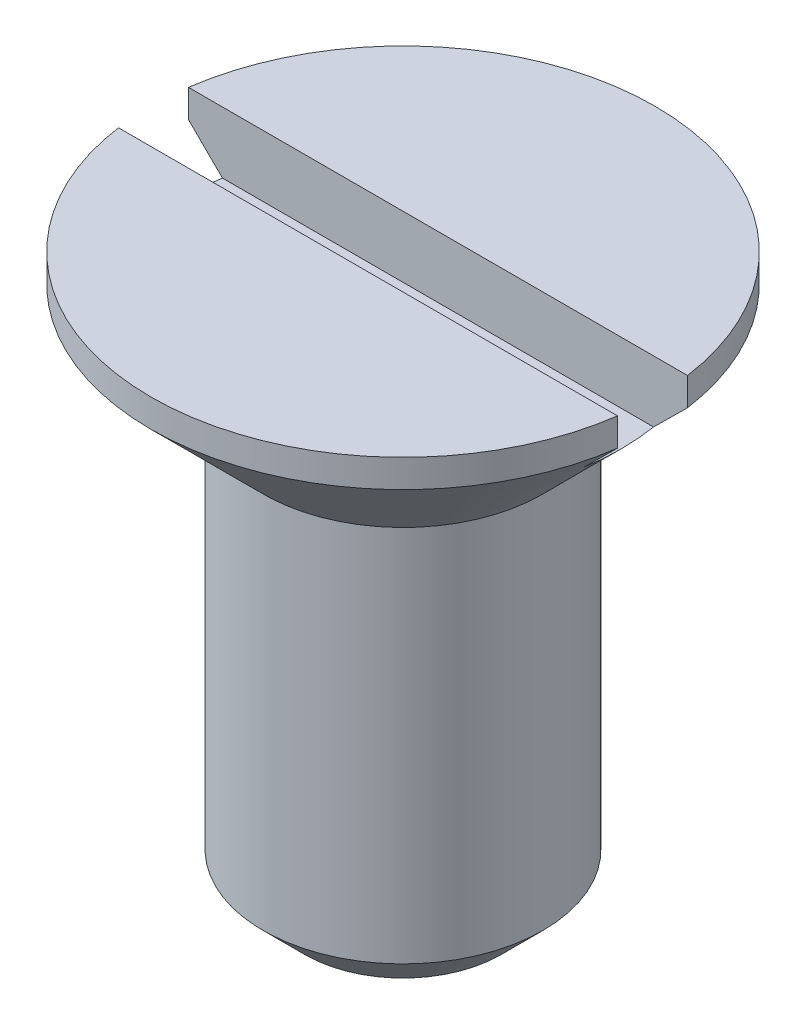
ISO-10303-21;
HEADER;
FILE_DESCRIPTION(('STEP AP214'),'2;1');
FILE_NAME('part.step','',(''),(''),'','','');
FILE_SCHEMA(('AUTOMOTIVE_DESIGN { 1 0 10303 214 1 1 1 1 }'));
ENDSEC;
DATA;
#1=APPLICATION_CONTEXT('core data for automotive mechanical design processes');
#2=APPLICATION_PROTOCOL_DEFINITION('international standard','automotive_design',2000,#1);
#3=PRODUCT_CONTEXT('',#1,'mechanical');
#4=PRODUCT('Part','Part','',(#3));
#5=PRODUCT_RELATED_PRODUCT_CATEGORY('part','',(#4));
#6=PRODUCT_DEFINITION_FORMATION('','',#4);
#7=PRODUCT_DEFINITION_CONTEXT('part definition',#1,'design');
#8=PRODUCT_DEFINITION('design','',#6,#7);
#9=PRODUCT_DEFINITION_SHAPE('','',#8);
#10=(LENGTH_UNIT() NAMED_UNIT(*) SI_UNIT(.MILLI.,.METRE.));
#11=(NAMED_UNIT(*) PLANE_ANGLE_UNIT() SI_UNIT($,.RADIAN.));
#12=(NAMED_UNIT(*) SI_UNIT($,.STERADIAN.) SOLID_ANGLE_UNIT());
#13=UNCERTAINTY_MEASURE_WITH_UNIT(LENGTH_MEASURE(1.E-05),#10,'distance_accuracy_value','');
#14=(GEOMETRIC_REPRESENTATION_CONTEXT(3) GLOBAL_UNCERTAINTY_ASSIGNED_CONTEXT((#13)) GLOBAL_UNIT_ASSIGNED_CONTEXT((#10,
#11,#12)) REPRESENTATION_CONTEXT('',''));
#15=CARTESIAN_POINT('',(0.,0.,0.));
#16=DIRECTION('',(0.,0.,1.));
#17=DIRECTION('',(1.,0.,0.));
#18=AXIS2_PLACEMENT_3D('',#15,#16,#17);
#19=CARTESIAN_POINT('',(0.,125.763182897862,0.));
#20=DIRECTION('',(0.,1.,0.));
#21=DIRECTION('',(-1.,0.,0.));
#22=AXIS2_PLACEMENT_3D('',#19,#20,#21);
#23=CYLINDRICAL_SURFACE('',#22,9.00000000000001);
#24=CARTESIAN_POINT('',(0.,91.0350422227854,0.));
#25=DIRECTION('',(0.,1.,0.));
#26=DIRECTION('',(-1.,0.,0.));
#27=AXIS2_PLACEMENT_3D('',#24,#25,#26);
#28=CIRCLE('',#27,9.00000000000001);
#29=CARTESIAN_POINT('',(8.91277173498795,91.0350422227854,-1.25));
#30=VERTEX_POINT('',#29);
#31=CARTESIAN_POINT('',(-8.91277173498796,91.0350422227854,-1.25));
#32=VERTEX_POINT('',#31);
#33=EDGE_CURVE('E103',#30,#32,#28,.T.);
#34=ORIENTED_EDGE('',*,*,#33,.T.);
#35=DIRECTION('',(0.,1.,0.));
#36=VECTOR('',#35,1.);
#37=CARTESIAN_POINT('',(-8.91277173498796,125.763182897862,-1.25));
#38=LINE('',#37,#36);
#39=CARTESIAN_POINT('',(-8.91277173498796,92.0350422227854,-1.25));
#40=VERTEX_POINT('',#39);
#41=EDGE_CURVE('E136',#32,#40,#38,.T.);
#42=ORIENTED_EDGE('',*,*,#41,.T.);
#43=CARTESIAN_POINT('',(0.,92.0350422227854,0.));
#44=DIRECTION('',(0.,1.,0.));
#45=DIRECTION('',(-1.,0.,0.));
#46=AXIS2_PLACEMENT_3D('',#43,#44,#45);
#47=CIRCLE('',#46,9.00000000000001);
#48=CARTESIAN_POINT('',(8.91277173498795,92.0350422227854,-1.25));
#49=VERTEX_POINT('',#48);
#50=EDGE_CURVE('E100',#49,#40,#47,.T.);
#51=ORIENTED_EDGE('',*,*,#50,.F.);
#52=DIRECTION('',(0.,1.,0.));
#53=VECTOR('',#52,1.);
#54=CARTESIAN_POINT('',(8.91277173498795,125.763182897862,-1.25));
#55=LINE('',#54,#53);
#56=EDGE_CURVE('E106',#49,#30,#55,.F.);
#57=ORIENTED_EDGE('',*,*,#56,.T.);
#58=EDGE_LOOP('',(#34,#42,#51,#57));
#59=FACE_BOUND('',#58,.T.);
#60=ADVANCED_FACE('F29',(#59),#23,.T.);
#61=CARTESIAN_POINT('',(0.,92.0350422227854,0.));
#62=DIRECTION('',(0.,-1.,0.));
#63=DIRECTION('',(1.,0.,0.));
#64=AXIS2_PLACEMENT_3D('',#61,#62,#63);
#65=PLANE('',#64);
#66=ORIENTED_EDGE('',*,*,#50,.T.);
#67=DIRECTION('',(1.,0.,0.));
#68=VECTOR('',#67,1.);
#69=CARTESIAN_POINT('',(0.,92.0350422227854,-1.25));
#70=LINE('',#69,#68);
#71=EDGE_CURVE('E88',#40,#49,#70,.T.);
#72=ORIENTED_EDGE('',*,*,#71,.T.);
#73=EDGE_LOOP('',(#66,#72));
#74=FACE_BOUND('',#73,.T.);
#75=ADVANCED_FACE('F162',(#74),#65,.F.);
#76=CARTESIAN_POINT('',(-8.91277173498796,91.0350422227854,1.25));
#77=VERTEX_POINT('',#76);
#78=CARTESIAN_POINT('',(8.91277173498795,91.0350422227854,1.25));
#79=VERTEX_POINT('',#78);
#80=EDGE_CURVE('E89',#77,#79,#28,.T.);
#81=ORIENTED_EDGE('',*,*,#80,.T.);
#82=DIRECTION('',(0.,1.,0.));
#83=VECTOR('',#82,1.);
#84=CARTESIAN_POINT('',(8.91277173498795,125.763182897862,1.25));
#85=LINE('',#84,#83);
#86=CARTESIAN_POINT('',(8.91277173498795,92.0350422227854,1.25));
#87=VERTEX_POINT('',#86);
#88=EDGE_CURVE('E83',#79,#87,#85,.T.);
#89=ORIENTED_EDGE('',*,*,#88,.T.);
#90=CARTESIAN_POINT('',(-8.91277173498796,92.0350422227854,1.25));
#91=VERTEX_POINT('',#90);
#92=EDGE_CURVE('E93',#91,#87,#47,.T.);
#93=ORIENTED_EDGE('',*,*,#92,.F.);
#94=DIRECTION('',(0.,1.,0.));
#95=VECTOR('',#94,1.);
#96=CARTESIAN_POINT('',(-8.91277173498796,125.763182897862,1.25));
#97=LINE('',#96,#95);
#98=EDGE_CURVE('E44',#91,#77,#97,.F.);
#99=ORIENTED_EDGE('',*,*,#98,.T.);
#100=EDGE_LOOP('',(#81,#89,#93,#99));
#101=FACE_BOUND('',#100,.T.);
#102=ADVANCED_FACE('F31',(#101),#23,.T.);
#103=CARTESIAN_POINT('',(0.,87.0350422227853,0.));
#104=DIRECTION('',(0.,1.,0.));
#105=DIRECTION('',(-1.,0.,0.));
#106=AXIS2_PLACEMENT_3D('',#103,#104,#105);
#107=CONICAL_SURFACE('',#106,5.00000000000001,0.785398163397446);
#108=ORIENTED_EDGE('',*,*,#33,.F.);
#109=CARTESIAN_POINT('',(19.7847251861902,101.859215615214,-1.25));
#110=CARTESIAN_POINT('',(19.1078339600706,101.183681664968,-1.25));
#111=CARTESIAN_POINT('',(18.4308835719795,100.508206961128,-1.25));
#112=CARTESIAN_POINT('',(17.0767780305073,99.1574394616129,-1.25));
#113=CARTESIAN_POINT('',(16.3996228737938,98.4821466692792,-1.25));
#114=CARTESIAN_POINT('',(15.0447829505632,97.1315687919128,-1.25));
#115=CARTESIAN_POINT('',(14.367098080507,96.4562838107283,-1.25));
#116=CARTESIAN_POINT('',(13.0113319594655,95.1061346836345,-1.25));
#117=CARTESIAN_POINT('',(12.3332507153435,94.4312705308337,-1.25));
#118=CARTESIAN_POINT('',(10.9605291891881,93.0663655002733,-1.25));
#119=CARTESIAN_POINT('',(10.2658736173766,92.3763399902808,-1.25));
#120=CARTESIAN_POINT('',(9.22295280283609,91.3422105610102,-1.25));
#121=CARTESIAN_POINT('',(8.87514715924491,90.9976432036848,-1.25));
#122=CARTESIAN_POINT('',(8.17909957243933,90.3089528258849,-1.25));
#123=CARTESIAN_POINT('',(7.83085763146732,89.9648298031449,-1.25));
#124=CARTESIAN_POINT('',(7.13381711358687,89.2773174627688,-1.25));
#125=CARTESIAN_POINT('',(6.78501869257612,88.9339279871064,-1.25));
#126=CARTESIAN_POINT('',(6.08643054083817,88.2481435452596,-1.25));
#127=CARTESIAN_POINT('',(5.73664079073574,87.9057485987816,-1.25));
#128=CARTESIAN_POINT('',(5.21072174096608,87.3934545750068,-1.25));
#129=CARTESIAN_POINT('',(5.03521758044936,87.2229139461952,-1.25));
#130=CARTESIAN_POINT('',(4.68364134829781,86.8824193192547,-1.25));
#131=CARTESIAN_POINT('',(4.50756927790836,86.7124653198409,-1.25));
#132=CARTESIAN_POINT('',(4.15464470238655,86.3733803825754,-1.25));
#133=CARTESIAN_POINT('',(3.97779222217955,86.2042494187945,-1.25));
#134=CARTESIAN_POINT('',(3.62296018910056,85.8671747406901,-1.25));
#135=CARTESIAN_POINT('',(3.44498065034489,85.699231011552,-1.25));
#136=CARTESIAN_POINT('',(3.21785413901981,85.4871131957764,-1.25));
#137=CARTESIAN_POINT('',(3.16950497935488,85.442084752162,-1.25));
#138=CARTESIAN_POINT('',(3.07266195799923,85.3521835155202,-1.25));
#139=CARTESIAN_POINT('',(3.02416809592682,85.3073107229041,-1.25));
#140=CARTESIAN_POINT('',(2.87844070149685,85.1729556187338,-1.25));
#141=CARTESIAN_POINT('',(2.78096271122023,85.0837378440573,-1.25));
#142=CARTESIAN_POINT('',(2.58532852654553,84.9064041726877,-1.25));
#143=CARTESIAN_POINT('',(2.48717387239869,84.8182865789091,-1.25));
#144=CARTESIAN_POINT('',(2.28972274167202,84.64334136164,-1.25));
#145=CARTESIAN_POINT('',(2.19042630230647,84.5565136963171,-1.25));
#146=CARTESIAN_POINT('',(2.0222903331037,84.412213889758,-1.25));
#147=CARTESIAN_POINT('',(1.95387863100165,84.3542439529258,-1.25));
#148=CARTESIAN_POINT('',(1.81611738719729,84.2394308782895,-1.25));
#149=CARTESIAN_POINT('',(1.74676788023867,84.1825876989329,-1.25));
#150=CARTESIAN_POINT('',(1.60661189935505,84.0702178601861,-1.25));
#151=CARTESIAN_POINT('',(1.53580122127716,84.0146964246929,-1.25));
#152=CARTESIAN_POINT('',(1.39257923267004,83.9057661950179,-1.25));
#153=CARTESIAN_POINT('',(1.32016818804461,83.8523570539273,-1.25));
#154=CARTESIAN_POINT('',(1.18443775219583,83.7565105858634,-1.25));
#155=CARTESIAN_POINT('',(1.12142281738342,83.7136449941715,-1.25));
#156=CARTESIAN_POINT('',(0.993365938075906,83.6309365837637,-1.25));
#157=CARTESIAN_POINT('',(0.928322817059164,83.5910955673742,-1.25));
#158=CARTESIAN_POINT('',(0.795986325530323,83.5159679616389,-1.25));
#159=CARTESIAN_POINT('',(0.728704024018894,83.4806622403029,-1.25));
#160=CARTESIAN_POINT('',(0.591205946460376,83.4164634753359,-1.25));
#161=CARTESIAN_POINT('',(0.520994631493804,83.3875610743441,-1.25));
#162=CARTESIAN_POINT('',(0.373304925932413,83.3376624692177,-1.25));
#163=CARTESIAN_POINT('',(0.295639139819324,83.3171861339863,-1.25));
#164=CARTESIAN_POINT('',(0.177495810884421,83.2969823891581,-1.25));
#165=CARTESIAN_POINT('',(0.137898738610523,83.2919992520731,-1.25));
#166=CARTESIAN_POINT('',(0.0584034052073918,83.2857802568944,-1.25));
#167=CARTESIAN_POINT('',(0.0185051645698796,83.2845441461135,-1.25));
#168=CARTESIAN_POINT('',(-0.0613254600109295,83.2859069846802,-1.25));
#169=CARTESIAN_POINT('',(-0.101257670386481,83.2885157485291,-1.25));
#170=CARTESIAN_POINT('',(-0.180710754962881,83.297419684747,-1.25));
#171=CARTESIAN_POINT('',(-0.220231533654409,83.3037156944685,-1.25));
#172=CARTESIAN_POINT('',(-0.298713942991682,83.3196616014071,-1.25));
#173=CARTESIAN_POINT('',(-0.337673342420108,83.3293223182391,-1.25));
#174=CARTESIAN_POINT('',(-0.414747518203297,83.3515354133954,-1.25));
#175=CARTESIAN_POINT('',(-0.45286224811967,83.3640879502766,-1.25));
#176=CARTESIAN_POINT('',(-0.576630117211929,83.4092910304112,-1.25));
#177=CARTESIAN_POINT('',(-0.660418883829966,83.4470367740296,-1.25));
#178=CARTESIAN_POINT('',(-0.82393915173479,83.5305068236413,-1.25));
#179=CARTESIAN_POINT('',(-0.90366147390656,83.5762482305406,-1.25));
#180=CARTESIAN_POINT('',(-1.06059904789446,83.6731945362786,-1.25));
#181=CARTESIAN_POINT('',(-1.13778774709978,83.7244419396597,-1.25));
#182=CARTESIAN_POINT('',(-1.25172958028484,83.803825623611,-1.25));
#183=CARTESIAN_POINT('',(-1.28938523042671,83.8306917666159,-1.25));
#184=CARTESIAN_POINT('',(-1.36418080987008,83.8851316615948,-1.25));
#185=CARTESIAN_POINT('',(-1.40132075686567,83.9127053891981,-1.25));
#186=CARTESIAN_POINT('',(-1.52042498960021,84.0025971686282,-1.25));
#187=CARTESIAN_POINT('',(-1.60151962282705,84.0660662621897,-1.25));
#188=CARTESIAN_POINT('',(-1.76212992390028,84.1949772947934,-1.25));
#189=CARTESIAN_POINT('',(-1.84164537404994,84.2604195027487,-1.25));
#190=CARTESIAN_POINT('',(-1.9995240053636,84.3927405696473,-1.25));
#191=CARTESIAN_POINT('',(-2.07788670408009,84.4596200028106,-1.25));
#192=CARTESIAN_POINT('',(-2.23370893955989,84.5944244139488,-1.25));
#193=CARTESIAN_POINT('',(-2.31116844913956,84.6623494232506,-1.25));
#194=CARTESIAN_POINT('',(-2.5427454241889,84.8675103899646,-1.25));
#195=CARTESIAN_POINT('',(-2.69581751718723,85.0059249667948,-1.25));
#196=CARTESIAN_POINT('',(-3.00016629026516,85.2846282316745,-1.25));
#197=CARTESIAN_POINT('',(-3.15144340143561,85.4249164518037,-1.25));
#198=CARTESIAN_POINT('',(-3.45203539616213,85.7060413200045,-1.25));
#199=CARTESIAN_POINT('',(-3.60135636325054,85.8468714701932,-1.25));
#200=CARTESIAN_POINT('',(-3.89917776506082,86.1294138462171,-1.25));
#201=CARTESIAN_POINT('',(-4.04767814787807,86.2711261266713,-1.25));
#202=CARTESIAN_POINT('',(-4.34393540765238,86.5550520861823,-1.25));
#203=CARTESIAN_POINT('',(-4.49169284457613,86.6972651813576,-1.25));
#204=CARTESIAN_POINT('',(-4.78674757747011,86.9821614198877,-1.25));
#205=CARTESIAN_POINT('',(-4.93404488301378,87.1248445533343,-1.25));
#206=CARTESIAN_POINT('',(-5.38999860074283,87.5675902184798,-1.25));
#207=CARTESIAN_POINT('',(-5.69806373194387,87.8682614963159,-1.25));
#208=CARTESIAN_POINT('',(-6.31325944166139,88.4705590039845,-1.25));
#209=CARTESIAN_POINT('',(-6.62039001733251,88.7721852367189,-1.25));
#210=CARTESIAN_POINT('',(-7.23403293141568,89.3760750568808,-1.25));
#211=CARTESIAN_POINT('',(-7.5405452604023,89.6783386538838,-1.25));
#212=CARTESIAN_POINT('',(-8.15313651353721,90.2833047970733,-1.25));
#213=CARTESIAN_POINT('',(-8.45921543749136,90.5860073434563,-1.25));
#214=CARTESIAN_POINT('',(-9.37726181639224,91.4948505163362,-1.25));
#215=CARTESIAN_POINT('',(-9.98876670086898,92.1014583217292,-1.25));
#216=CARTESIAN_POINT('',(-11.2110778556966,93.3153684799989,-1.25));
#217=CARTESIAN_POINT('',(-11.8218841308321,93.9226708280611,-1.25));
#218=CARTESIAN_POINT('',(-13.0458740170741,95.1405205715863,-1.25));
#219=CARTESIAN_POINT('',(-13.6590555941939,95.7510700111574,-1.25));
#220=CARTESIAN_POINT('',(-14.8851256353801,96.9724659205214,-1.25));
#221=CARTESIAN_POINT('',(-15.4980140987625,97.5833123910008,-1.25));
#222=CARTESIAN_POINT('',(-16.7232915760962,98.804917722342,-1.25));
#223=CARTESIAN_POINT('',(-17.3356806885543,99.4156764844076,-1.25));
#224=CARTESIAN_POINT('',(-18.5603049246154,100.637345350159,-1.25));
#225=CARTESIAN_POINT('',(-19.1725400485951,101.248255453467,-1.25));
#226=CARTESIAN_POINT('',(-19.7847251861902,101.859215615214,-1.25));
#227=B_SPLINE_CURVE_WITH_KNOTS('',3,(#109,#110,#111,#112,#113,#114,#115,#116,#117,#118,#119,
#120,#121,#122,#123,#124,#125,#126,#127,#128,#129,#130,#131,#132,#133,#134,#135,#136,#137,#138,
#139,#140,#141,#142,#143,#144,#145,#146,#147,#148,#149,#150,#151,#152,#153,#154,#155,#156,#157,
#158,#159,#160,#161,#162,#163,#164,#165,#166,#167,#168,#169,#170,#171,#172,#173,#174,#175,#176,
#177,#178,#179,#180,#181,#182,#183,#184,#185,#186,#187,#188,#189,#190,#191,#192,#193,#194,#195,
#196,#197,#198,#199,#200,#201,#202,#203,#204,#205,#206,#207,#208,#209,#210,#211,#212,#213,#214,
#215,#216,#217,#218,#219,#220,#221,#222,#223,#224,#225,#226),.UNSPECIFIED.,.F.,.F.,(4,2,2,2,2,2,
2,2,2,2,2,2,2,2,2,2,2,2,2,2,2,2,2,2,2,2,2,2,2,2,2,2,2,2,2,2,2,2,2,2,2,2,2,2,2,2,2,2,2,2,2,2,2,2,
2,2,2,2,4),(0.,2.8689285152752,5.73790654520621,8.6079933954207,11.4780319404897,
14.4153994436756,15.8841601981707,17.3529134345376,18.821309618551,20.289734702646,
21.0238811629332,21.7580260143806,22.492147585404,23.2262599797225,23.4244687011785,
23.622677945908,24.0191019823921,24.4148110481106,24.8105072528111,25.0795079719503,
25.3484987523421,25.6184183894229,25.8882935111005,26.1168692880001,26.3455802197769,
26.57329222939,26.8006692490929,27.040502715344,27.1600758740025,27.2796409688613,
27.3995117969784,27.5194098576398,27.6396970796911,27.7599908985904,28.0348986137804,
28.3104016533647,28.5882094580161,28.7269767511443,28.8657392712598,29.1746250276544,
29.4835530736927,29.7926069301987,30.1016700645354,30.7207562544512,31.3396906232892,
31.9554521958011,32.5712522813345,33.1864836913452,33.8017022145311,35.093118266856,
36.3845382471062,37.6759777689905,38.9674178691601,41.5514447378153,44.1354538018871,
46.7313851368796,49.3273225008445,51.9220132440384,54.5166975798243),.UNSPECIFIED.);
#228=CARTESIAN_POINT('',(7.69918826890212,89.8350422227854,-1.25));
#229=VERTEX_POINT('',#228);
#230=EDGE_CURVE('E52',#30,#229,#227,.T.);
#231=ORIENTED_EDGE('',*,*,#230,.T.);
#232=CARTESIAN_POINT('',(0.,89.8350422227854,0.));
#233=DIRECTION('',(0.,1.,0.));
#234=DIRECTION('',(0.,0.,1.));
#235=AXIS2_PLACEMENT_3D('',#232,#233,#234);
#236=CIRCLE('',#235,7.80000000000001);
#237=CARTESIAN_POINT('',(7.69918826890212,89.8350422227854,1.25));
#238=VERTEX_POINT('',#237);
#239=EDGE_CURVE('E115',#238,#229,#236,.T.);
#240=ORIENTED_EDGE('',*,*,#239,.F.);
#241=CARTESIAN_POINT('',(-19.7847251861902,101.859215615214,1.25));
#242=CARTESIAN_POINT('',(-19.1078339600707,101.183681664968,1.25));
#243=CARTESIAN_POINT('',(-18.4308835719795,100.508206961128,1.25));
#244=CARTESIAN_POINT('',(-17.0767780305073,99.1574394616129,1.25));
#245=CARTESIAN_POINT('',(-16.3996228737938,98.4821466692792,1.25));
#246=CARTESIAN_POINT('',(-15.0447829505632,97.1315687919128,1.25));
#247=CARTESIAN_POINT('',(-14.367098080507,96.4562838107283,1.25));
#248=CARTESIAN_POINT('',(-13.0113319594655,95.1061346836345,1.25));
#249=CARTESIAN_POINT('',(-12.3332507153435,94.4312705308337,1.25));
#250=CARTESIAN_POINT('',(-10.9605291891881,93.0663655002733,1.25));
#251=CARTESIAN_POINT('',(-10.2658736173766,92.3763399902808,1.25));
#252=CARTESIAN_POINT('',(-9.22295280283609,91.3422105610101,1.25));
#253=CARTESIAN_POINT('',(-8.87514715924491,90.9976432036848,1.25));
#254=CARTESIAN_POINT('',(-8.17909957243933,90.3089528258849,1.25));
#255=CARTESIAN_POINT('',(-7.83085763146732,89.9648298031449,1.25));
#256=CARTESIAN_POINT('',(-7.13381711358687,89.2773174627687,1.25));
#257=CARTESIAN_POINT('',(-6.78501869257612,88.9339279871064,1.25));
#258=CARTESIAN_POINT('',(-6.08643054083818,88.2481435452596,1.25));
#259=CARTESIAN_POINT('',(-5.73664079073574,87.9057485987816,1.25));
#260=CARTESIAN_POINT('',(-5.21072174096609,87.3934545750068,1.25));
#261=CARTESIAN_POINT('',(-5.03521758044937,87.2229139461952,1.25));
#262=CARTESIAN_POINT('',(-4.68364134829782,86.8824193192547,1.25));
#263=CARTESIAN_POINT('',(-4.50756927790837,86.7124653198409,1.25));
#264=CARTESIAN_POINT('',(-4.15464470238656,86.3733803825754,1.25));
#265=CARTESIAN_POINT('',(-3.97779222217957,86.2042494187945,1.25));
#266=CARTESIAN_POINT('',(-3.62296018910058,85.8671747406901,1.25));
#267=CARTESIAN_POINT('',(-3.44498065034491,85.699231011552,1.25));
#268=CARTESIAN_POINT('',(-3.21785413901982,85.4871131957764,1.25));
#269=CARTESIAN_POINT('',(-3.16950497935489,85.442084752162,1.25));
#270=CARTESIAN_POINT('',(-3.07266195799924,85.3521835155202,1.25));
#271=CARTESIAN_POINT('',(-3.02416809592683,85.3073107229041,1.25));
#272=CARTESIAN_POINT('',(-2.87844070149686,85.1729556187338,1.25));
#273=CARTESIAN_POINT('',(-2.78096271122024,85.0837378440573,1.25));
#274=CARTESIAN_POINT('',(-2.58532852654554,84.9064041726877,1.25));
#275=CARTESIAN_POINT('',(-2.4871738723987,84.8182865789091,1.25));
#276=CARTESIAN_POINT('',(-2.28972274167203,84.64334136164,1.25));
#277=CARTESIAN_POINT('',(-2.19042630230648,84.5565136963171,1.25));
#278=CARTESIAN_POINT('',(-2.02229033310372,84.412213889758,1.25));
#279=CARTESIAN_POINT('',(-1.95387863100166,84.3542439529258,1.25));
#280=CARTESIAN_POINT('',(-1.81611738719731,84.2394308782895,1.25));
#281=CARTESIAN_POINT('',(-1.74676788023868,84.1825876989329,1.25));
#282=CARTESIAN_POINT('',(-1.60661189935506,84.0702178601861,1.25));
#283=CARTESIAN_POINT('',(-1.53580122127718,84.0146964246929,1.25));
#284=CARTESIAN_POINT('',(-1.39257923267006,83.9057661950179,1.25));
#285=CARTESIAN_POINT('',(-1.32016818804462,83.8523570539273,1.25));
#286=CARTESIAN_POINT('',(-1.18443775219585,83.7565105858634,1.25));
#287=CARTESIAN_POINT('',(-1.12142281738343,83.7136449941715,1.25));
#288=CARTESIAN_POINT('',(-0.993365938075916,83.6309365837637,1.25));
#289=CARTESIAN_POINT('',(-0.928322817059174,83.5910955673742,1.25));
#290=CARTESIAN_POINT('',(-0.795986325530335,83.5159679616389,1.25));
#291=CARTESIAN_POINT('',(-0.728704024018906,83.4806622403029,1.25));
#292=CARTESIAN_POINT('',(-0.591205946460388,83.4164634753359,1.25));
#293=CARTESIAN_POINT('',(-0.520994631493816,83.3875610743441,1.25));
#294=CARTESIAN_POINT('',(-0.373304925932425,83.3376624692177,1.25));
#295=CARTESIAN_POINT('',(-0.295639139819336,83.3171861339863,1.25));
#296=CARTESIAN_POINT('',(-0.177495810884434,83.2969823891581,1.25));
#297=CARTESIAN_POINT('',(-0.137898738610536,83.2919992520731,1.25));
#298=CARTESIAN_POINT('',(-0.0584034052074043,83.2857802568944,1.25));
#299=CARTESIAN_POINT('',(-0.0185051645698921,83.2845441461135,1.25));
#300=CARTESIAN_POINT('',(0.061325460010917,83.2859069846802,1.25));
#301=CARTESIAN_POINT('',(0.101257670386468,83.2885157485291,1.25));
#302=CARTESIAN_POINT('',(0.180710754962868,83.297419684747,1.25));
#303=CARTESIAN_POINT('',(0.220231533654397,83.3037156944685,1.25));
#304=CARTESIAN_POINT('',(0.29871394299167,83.3196616014071,1.25));
#305=CARTESIAN_POINT('',(0.337673342420095,83.3293223182391,1.25));
#306=CARTESIAN_POINT('',(0.414747518203284,83.3515354133954,1.25));
#307=CARTESIAN_POINT('',(0.452862248119657,83.3640879502766,1.25));
#308=CARTESIAN_POINT('',(0.576630117211911,83.4092910304112,1.25));
#309=CARTESIAN_POINT('',(0.660418883829946,83.4470367740296,1.25));
#310=CARTESIAN_POINT('',(0.823939151734771,83.5305068236413,1.25));
#311=CARTESIAN_POINT('',(0.903661473906543,83.5762482305406,1.25));
#312=CARTESIAN_POINT('',(1.06059904789444,83.6731945362786,1.25));
#313=CARTESIAN_POINT('',(1.13778774709978,83.7244419396597,1.25));
#314=CARTESIAN_POINT('',(1.25172958028483,83.803825623611,1.25));
#315=CARTESIAN_POINT('',(1.2893852304267,83.8306917666159,1.25));
#316=CARTESIAN_POINT('',(1.36418080987006,83.8851316615948,1.25));
#317=CARTESIAN_POINT('',(1.40132075686565,83.9127053891981,1.25));
#318=CARTESIAN_POINT('',(1.52042498960019,84.0025971686282,1.25));
#319=CARTESIAN_POINT('',(1.60151962282704,84.0660662621897,1.25));
#320=CARTESIAN_POINT('',(1.76212992390026,84.1949772947934,1.25));
#321=CARTESIAN_POINT('',(1.84164537404993,84.2604195027487,1.25));
#322=CARTESIAN_POINT('',(1.99952400536358,84.3927405696473,1.25));
#323=CARTESIAN_POINT('',(2.07788670408007,84.4596200028106,1.25));
#324=CARTESIAN_POINT('',(2.23370893955987,84.5944244139488,1.25));
#325=CARTESIAN_POINT('',(2.31116844913954,84.6623494232506,1.25));
#326=CARTESIAN_POINT('',(2.54274542418888,84.8675103899646,1.25));
#327=CARTESIAN_POINT('',(2.69581751718722,85.0059249667948,1.25));
#328=CARTESIAN_POINT('',(3.00016629026516,85.2846282316745,1.25));
#329=CARTESIAN_POINT('',(3.1514434014356,85.4249164518037,1.25));
#330=CARTESIAN_POINT('',(3.45203539616212,85.7060413200045,1.25));
#331=CARTESIAN_POINT('',(3.60135636325054,85.8468714701932,1.25));
#332=CARTESIAN_POINT('',(3.89917776506081,86.1294138462171,1.25));
#333=CARTESIAN_POINT('',(4.04767814787806,86.2711261266713,1.25));
#334=CARTESIAN_POINT('',(4.34393540765236,86.5550520861823,1.25));
#335=CARTESIAN_POINT('',(4.49169284457611,86.6972651813576,1.25));
#336=CARTESIAN_POINT('',(4.78674757747009,86.9821614198877,1.25));
#337=CARTESIAN_POINT('',(4.93404488301376,87.1248445533343,1.25));
#338=CARTESIAN_POINT('',(5.38999860074281,87.5675902184798,1.25));
#339=CARTESIAN_POINT('',(5.69806373194385,87.8682614963159,1.25));
#340=CARTESIAN_POINT('',(6.31325944166136,88.4705590039845,1.25));
#341=CARTESIAN_POINT('',(6.62039001733248,88.7721852367189,1.25));
#342=CARTESIAN_POINT('',(7.23403293141565,89.3760750568808,1.25));
#343=CARTESIAN_POINT('',(7.54054526040227,89.6783386538838,1.25));
#344=CARTESIAN_POINT('',(8.15313651353719,90.2833047970733,1.25));
#345=CARTESIAN_POINT('',(8.45921543749135,90.5860073434562,1.25));
#346=CARTESIAN_POINT('',(9.37726181639222,91.4948505163362,1.25));
#347=CARTESIAN_POINT('',(9.98876670086896,92.1014583217292,1.25));
#348=CARTESIAN_POINT('',(11.2110778556966,93.3153684799988,1.25));
#349=CARTESIAN_POINT('',(11.8218841308321,93.9226708280611,1.25));
#350=CARTESIAN_POINT('',(13.0458740170741,95.1405205715863,1.25));
#351=CARTESIAN_POINT('',(13.6590555941939,95.7510700111574,1.25));
#352=CARTESIAN_POINT('',(14.8851256353801,96.9724659205214,1.25));
#353=CARTESIAN_POINT('',(15.4980140987625,97.5833123910008,1.25));
#354=CARTESIAN_POINT('',(16.7232915760962,98.804917722342,1.25));
#355=CARTESIAN_POINT('',(17.3356806885543,99.4156764844076,1.25));
#356=CARTESIAN_POINT('',(18.5603049246154,100.637345350159,1.25));
#357=CARTESIAN_POINT('',(19.1725400485951,101.248255453467,1.25));
#358=CARTESIAN_POINT('',(19.7847251861902,101.859215615214,1.25));
#359=B_SPLINE_CURVE_WITH_KNOTS('',3,(#241,#242,#243,#244,#245,#246,#247,#248,#249,#250,#251,
#252,#253,#254,#255,#256,#257,#258,#259,#260,#261,#262,#263,#264,#265,#266,#267,#268,#269,#270,
#271,#272,#273,#274,#275,#276,#277,#278,#279,#280,#281,#282,#283,#284,#285,#286,#287,#288,#289,
#290,#291,#292,#293,#294,#295,#296,#297,#298,#299,#300,#301,#302,#303,#304,#305,#306,#307,#308,
#309,#310,#311,#312,#313,#314,#315,#316,#317,#318,#319,#320,#321,#322,#323,#324,#325,#326,#327,
#328,#329,#330,#331,#332,#333,#334,#335,#336,#337,#338,#339,#340,#341,#342,#343,#344,#345,#346,
#347,#348,#349,#350,#351,#352,#353,#354,#355,#356,#357,#358),.UNSPECIFIED.,.F.,.F.,(4,2,2,2,2,2,
2,2,2,2,2,2,2,2,2,2,2,2,2,2,2,2,2,2,2,2,2,2,2,2,2,2,2,2,2,2,2,2,2,2,2,2,2,2,2,2,2,2,2,2,2,2,2,2,
2,2,2,2,4),(0.,2.8689285152752,5.73790654520623,8.60799339542071,11.4780319404897,
14.4153994436756,15.8841601981708,17.3529134345376,18.821309618551,20.289734702646,
21.0238811629331,21.7580260143806,22.492147585404,23.2262599797225,23.4244687011785,
23.622677945908,24.0191019823921,24.4148110481106,24.8105072528111,25.0795079719503,
25.3484987523421,25.6184183894228,25.8882935111005,26.1168692880001,26.3455802197769,
26.57329222939,26.8006692490929,27.040502715344,27.1600758740025,27.2796409688613,
27.3995117969784,27.5194098576398,27.6396970796911,27.7599908985904,28.0348986137803,
28.3104016533647,28.5882094580162,28.7269767511443,28.8657392712598,29.1746250276544,
29.4835530736927,29.7926069301987,30.1016700645354,30.7207562544512,31.3396906232892,
31.9554521958011,32.5712522813345,33.1864836913452,33.8017022145311,35.093118266856,
36.3845382471062,37.6759777689905,38.9674178691601,41.5514447378152,44.1354538018871,
46.7313851368796,49.3273225008445,51.9220132440384,54.5166975798243),.UNSPECIFIED.);
#360=EDGE_CURVE('E96',#238,#79,#359,.T.);
#361=ORIENTED_EDGE('',*,*,#360,.T.);
#362=ORIENTED_EDGE('',*,*,#80,.F.);
#363=CARTESIAN_POINT('',(-7.69918826890213,89.8350422227854,1.25));
#364=VERTEX_POINT('',#363);
#365=EDGE_CURVE('E95',#77,#364,#359,.T.);
#366=ORIENTED_EDGE('',*,*,#365,.T.);
#367=CARTESIAN_POINT('',(-7.69918826890213,89.8350422227854,-1.25));
#368=VERTEX_POINT('',#367);
#369=EDGE_CURVE('E114',#368,#364,#236,.T.);
#370=ORIENTED_EDGE('',*,*,#369,.F.);
#371=EDGE_CURVE('E131',#368,#32,#227,.T.);
#372=ORIENTED_EDGE('',*,*,#371,.T.);
#373=EDGE_LOOP('',(#108,#231,#240,#361,#362,#366,#370,#372));
#374=FACE_BOUND('',#373,.T.);
#375=CARTESIAN_POINT('',(0.,87.0350422227853,0.));
#376=DIRECTION('',(0.,1.,0.));
#377=DIRECTION('',(-1.,0.,0.));
#378=AXIS2_PLACEMENT_3D('',#375,#376,#377);
#379=CIRCLE('',#378,5.00000000000001);
#380=CARTESIAN_POINT('',(-5.00000000000002,87.0350422227853,0.));
#381=VERTEX_POINT('',#380);
#382=EDGE_CURVE('E99',#381,#381,#379,.T.);
#383=ORIENTED_EDGE('',*,*,#382,.T.);
#384=EDGE_LOOP('',(#383));
#385=FACE_BOUND('',#384,.T.);
#386=ADVANCED_FACE('F134',(#374,#385),#107,.T.);
#387=CARTESIAN_POINT('',(0.,125.763182897862,0.));
#388=DIRECTION('',(0.,1.,0.));
#389=DIRECTION('',(-1.,0.,0.));
#390=AXIS2_PLACEMENT_3D('',#387,#388,#389);
#391=CYLINDRICAL_SURFACE('',#390,5.00000000000001);
#392=CARTESIAN_POINT('',(0.,73.5350422227853,0.));
#393=DIRECTION('',(0.,1.,0.));
#394=DIRECTION('',(-1.,0.,0.));
#395=AXIS2_PLACEMENT_3D('',#392,#393,#394);
#396=CIRCLE('',#395,5.00000000000001);
#397=CARTESIAN_POINT('',(-5.00000000000002,73.5350422227853,0.));
#398=VERTEX_POINT('',#397);
#399=EDGE_CURVE('E37',#398,#398,#396,.T.);
#400=ORIENTED_EDGE('',*,*,#399,.T.);
#401=EDGE_LOOP('',(#400));
#402=FACE_BOUND('',#401,.T.);
#403=ORIENTED_EDGE('',*,*,#382,.F.);
#404=EDGE_LOOP('',(#403));
#405=FACE_BOUND('',#404,.T.);
#406=ADVANCED_FACE('F164',(#402,#405),#391,.T.);
#407=CARTESIAN_POINT('',(5.00000000000001,72.0350422227853,0.));
#408=DIRECTION('',(0.,1.,0.));
#409=DIRECTION('',(-1.,0.,0.));
#410=AXIS2_PLACEMENT_3D('',#407,#408,#409);
#411=PLANE('',#410);
#412=CARTESIAN_POINT('',(0.,72.0350422227853,0.));
#413=DIRECTION('',(0.,1.,0.));
#414=DIRECTION('',(-1.,0.,0.));
#415=AXIS2_PLACEMENT_3D('',#412,#413,#414);
#416=CIRCLE('',#415,3.50000000000001);
#417=CARTESIAN_POINT('',(-3.50000000000002,72.0350422227853,0.));
#418=VERTEX_POINT('',#417);
#419=EDGE_CURVE('E11',#418,#418,#416,.F.);
#420=ORIENTED_EDGE('',*,*,#419,.T.);
#421=EDGE_LOOP('',(#420));
#422=FACE_BOUND('',#421,.T.);
#423=ADVANCED_FACE('F161',(#422),#411,.F.);
#424=ORIENTED_EDGE('',*,*,#92,.T.);
#425=DIRECTION('',(-1.,0.,0.));
#426=VECTOR('',#425,1.);
#427=CARTESIAN_POINT('',(0.,92.0350422227854,1.25));
#428=LINE('',#427,#426);
#429=EDGE_CURVE('E80',#87,#91,#428,.T.);
#430=ORIENTED_EDGE('',*,*,#429,.T.);
#431=EDGE_LOOP('',(#424,#430));
#432=FACE_BOUND('',#431,.T.);
#433=ADVANCED_FACE('F98',(#432),#65,.F.);
#434=CARTESIAN_POINT('',(-9.00000000000001,89.8350422227854,1.25));
#435=DIRECTION('',(0.,1.,0.));
#436=DIRECTION('',(0.,0.,1.));
#437=AXIS2_PLACEMENT_3D('',#434,#435,#436);
#438=PLANE('',#437);
#439=ORIENTED_EDGE('',*,*,#239,.T.);
#440=DIRECTION('',(-1.,0.,0.));
#441=VECTOR('',#440,1.);
#442=CARTESIAN_POINT('',(-9.00000000000001,89.8350422227854,-1.25));
#443=LINE('',#442,#441);
#444=EDGE_CURVE('E124',#229,#368,#443,.T.);
#445=ORIENTED_EDGE('',*,*,#444,.T.);
#446=ORIENTED_EDGE('',*,*,#369,.T.);
#447=DIRECTION('',(1.,0.,0.));
#448=VECTOR('',#447,1.);
#449=CARTESIAN_POINT('',(-9.00000000000001,89.8350422227854,1.25));
#450=LINE('',#449,#448);
#451=EDGE_CURVE('E127',#364,#238,#450,.T.);
#452=ORIENTED_EDGE('',*,*,#451,.T.);
#453=EDGE_LOOP('',(#439,#445,#446,#452));
#454=FACE_BOUND('',#453,.T.);
#455=ADVANCED_FACE('F123',(#454),#438,.T.);
#456=CARTESIAN_POINT('',(-9.00000000000001,89.8350422227854,-1.25));
#457=DIRECTION('',(0.,0.,-1.));
#458=DIRECTION('',(-1.,0.,0.));
#459=AXIS2_PLACEMENT_3D('',#456,#457,#458);
#460=PLANE('',#459);
#461=ORIENTED_EDGE('',*,*,#71,.F.);
#462=ORIENTED_EDGE('',*,*,#41,.F.);
#463=ORIENTED_EDGE('',*,*,#371,.F.);
#464=ORIENTED_EDGE('',*,*,#444,.F.);
#465=ORIENTED_EDGE('',*,*,#230,.F.);
#466=ORIENTED_EDGE('',*,*,#56,.F.);
#467=EDGE_LOOP('',(#461,#462,#463,#464,#465,#466));
#468=FACE_BOUND('',#467,.T.);
#469=ADVANCED_FACE('F129',(#468),#460,.F.);
#470=CARTESIAN_POINT('',(-9.00000000000001,89.8350422227854,1.25));
#471=DIRECTION('',(0.,0.,1.));
#472=DIRECTION('',(1.,0.,0.));
#473=AXIS2_PLACEMENT_3D('',#470,#471,#472);
#474=PLANE('',#473);
#475=ORIENTED_EDGE('',*,*,#429,.F.);
#476=ORIENTED_EDGE('',*,*,#88,.F.);
#477=ORIENTED_EDGE('',*,*,#360,.F.);
#478=ORIENTED_EDGE('',*,*,#451,.F.);
#479=ORIENTED_EDGE('',*,*,#365,.F.);
#480=ORIENTED_EDGE('',*,*,#98,.F.);
#481=EDGE_LOOP('',(#475,#476,#477,#478,#479,#480));
#482=FACE_BOUND('',#481,.T.);
#483=ADVANCED_FACE('F82',(#482),#474,.F.);
#484=CARTESIAN_POINT('',(0.,73.5350422227853,0.));
#485=DIRECTION('',(0.,1.,0.));
#486=DIRECTION('',(-1.,0.,0.));
#487=AXIS2_PLACEMENT_3D('',#484,#485,#486);
#488=CONICAL_SURFACE('',#487,5.00000000000001,0.785398163397447);
#489=ORIENTED_EDGE('',*,*,#419,.F.);
#490=EDGE_LOOP('',(#489));
#491=FACE_BOUND('',#490,.T.);
#492=ORIENTED_EDGE('',*,*,#399,.F.);
#493=EDGE_LOOP('',(#492));
#494=FACE_BOUND('',#493,.T.);
#495=ADVANCED_FACE('F156',(#491,#494),#488,.T.);
#496=CLOSED_SHELL('',(#60,#75,#102,#386,#406,#423,#433,#455,#469,#483,#495));
#497=MANIFOLD_SOLID_BREP('B2',#496);
#498=ADVANCED_BREP_SHAPE_REPRESENTATION('',(#18,#497),#14);
#499=SHAPE_DEFINITION_REPRESENTATION(#9,#498);
ENDSEC;
END-ISO-10303-21;
